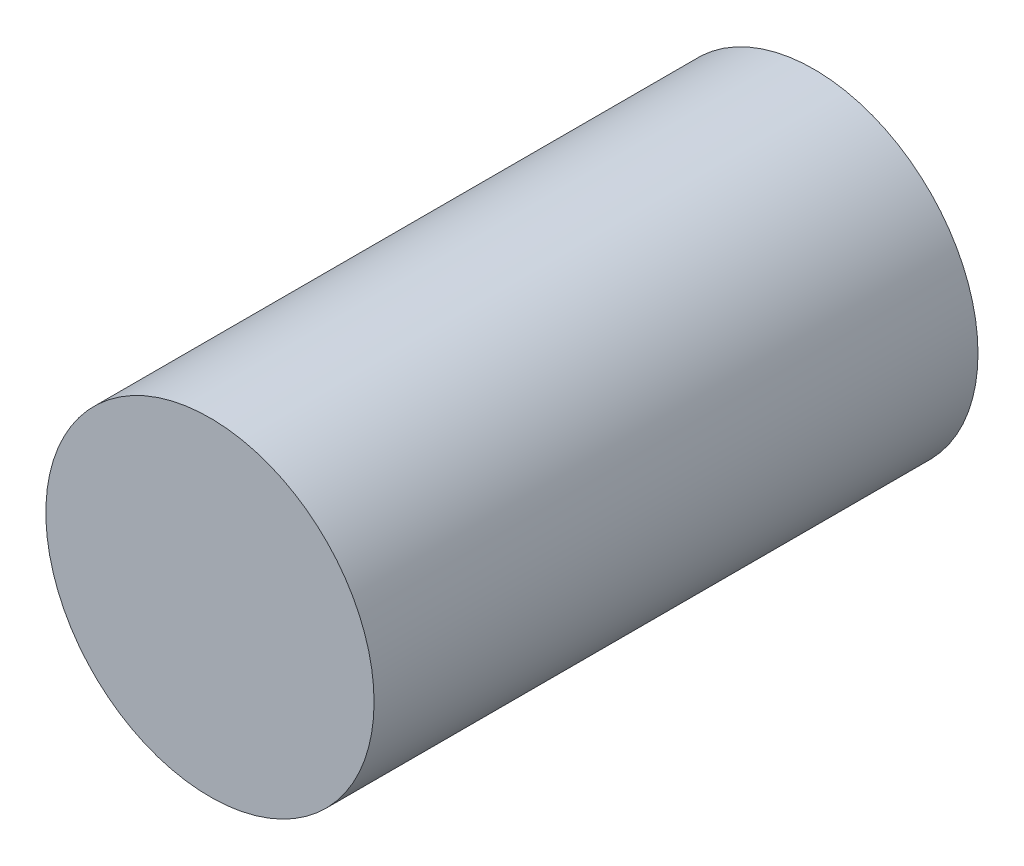
ISO-10303-21;
HEADER;
FILE_DESCRIPTION(('STEP AP214'),'2;1');
FILE_NAME('part.step','',(''),(''),'','','');
FILE_SCHEMA(('AUTOMOTIVE_DESIGN { 1 0 10303 214 1 1 1 1 }'));
ENDSEC;
DATA;
#1=APPLICATION_CONTEXT('core data for automotive mechanical design processes');
#2=APPLICATION_PROTOCOL_DEFINITION('international standard','automotive_design',2000,#1);
#3=PRODUCT_CONTEXT('',#1,'mechanical');
#4=PRODUCT('Part','Part','',(#3));
#5=PRODUCT_RELATED_PRODUCT_CATEGORY('part','',(#4));
#6=PRODUCT_DEFINITION_FORMATION('','',#4);
#7=PRODUCT_DEFINITION_CONTEXT('part definition',#1,'design');
#8=PRODUCT_DEFINITION('design','',#6,#7);
#9=PRODUCT_DEFINITION_SHAPE('','',#8);
#10=(LENGTH_UNIT() NAMED_UNIT(*) SI_UNIT(.MILLI.,.METRE.));
#11=(NAMED_UNIT(*) PLANE_ANGLE_UNIT() SI_UNIT($,.RADIAN.));
#12=(NAMED_UNIT(*) SI_UNIT($,.STERADIAN.) SOLID_ANGLE_UNIT());
#13=UNCERTAINTY_MEASURE_WITH_UNIT(LENGTH_MEASURE(1.E-05),#10,'distance_accuracy_value','');
#14=(GEOMETRIC_REPRESENTATION_CONTEXT(3) GLOBAL_UNCERTAINTY_ASSIGNED_CONTEXT((#13)) GLOBAL_UNIT_ASSIGNED_CONTEXT((#10,
#11,#12)) REPRESENTATION_CONTEXT('',''));
#15=CARTESIAN_POINT('',(0.,0.,0.));
#16=DIRECTION('',(0.,0.,1.));
#17=DIRECTION('',(1.,0.,0.));
#18=AXIS2_PLACEMENT_3D('',#15,#16,#17);
#19=CARTESIAN_POINT('',(0.,0.,46.));
#20=DIRECTION('',(0.,0.,-1.));
#21=DIRECTION('',(-1.,0.,0.));
#22=AXIS2_PLACEMENT_3D('',#19,#20,#21);
#23=CYLINDRICAL_SURFACE('',#22,12.5);
#24=CARTESIAN_POINT('',(0.,0.,46.));
#25=DIRECTION('',(0.,0.,1.));
#26=DIRECTION('',(1.,0.,0.));
#27=AXIS2_PLACEMENT_3D('',#24,#25,#26);
#28=CIRCLE('',#27,12.5);
#29=CARTESIAN_POINT('',(12.5,0.,46.));
#30=VERTEX_POINT('',#29);
#31=EDGE_CURVE('E10',#30,#30,#28,.T.);
#32=ORIENTED_EDGE('',*,*,#31,.F.);
#33=EDGE_LOOP('',(#32));
#34=FACE_BOUND('',#33,.T.);
#35=CARTESIAN_POINT('',(0.,0.,0.));
#36=DIRECTION('',(0.,0.,1.));
#37=DIRECTION('',(1.,0.,0.));
#38=AXIS2_PLACEMENT_3D('',#35,#36,#37);
#39=CIRCLE('',#38,12.5);
#40=CARTESIAN_POINT('',(12.5,0.,0.));
#41=VERTEX_POINT('',#40);
#42=EDGE_CURVE('E40',#41,#41,#39,.T.);
#43=ORIENTED_EDGE('',*,*,#42,.T.);
#44=EDGE_LOOP('',(#43));
#45=FACE_BOUND('',#44,.T.);
#46=ADVANCED_FACE('F37',(#34,#45),#23,.T.);
#47=CARTESIAN_POINT('',(0.,0.,46.));
#48=DIRECTION('',(0.,0.,1.));
#49=DIRECTION('',(1.,0.,0.));
#50=AXIS2_PLACEMENT_3D('',#47,#48,#49);
#51=PLANE('',#50);
#52=ORIENTED_EDGE('',*,*,#31,.T.);
#53=EDGE_LOOP('',(#52));
#54=FACE_BOUND('',#53,.T.);
#55=ADVANCED_FACE('F54',(#54),#51,.T.);
#56=CARTESIAN_POINT('',(0.,0.,0.));
#57=DIRECTION('',(0.,0.,1.));
#58=DIRECTION('',(1.,0.,0.));
#59=AXIS2_PLACEMENT_3D('',#56,#57,#58);
#60=PLANE('',#59);
#61=ORIENTED_EDGE('',*,*,#42,.F.);
#62=EDGE_LOOP('',(#61));
#63=FACE_BOUND('',#62,.T.);
#64=ADVANCED_FACE('F52',(#63),#60,.F.);
#65=CLOSED_SHELL('',(#46,#55,#64));
#66=MANIFOLD_SOLID_BREP('B2',#65);
#67=ADVANCED_BREP_SHAPE_REPRESENTATION('',(#18,#66),#14);
#68=SHAPE_DEFINITION_REPRESENTATION(#9,#67);
ENDSEC;
END-ISO-10303-21;
